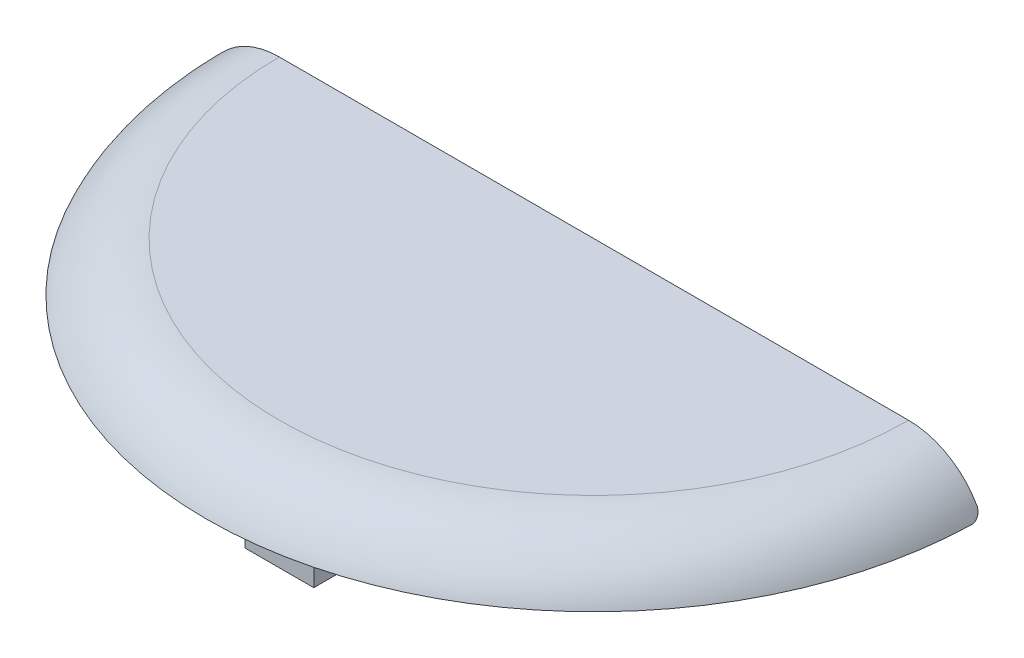
ISO-10303-21;
HEADER;
FILE_DESCRIPTION(('STEP AP214'),'2;1');
FILE_NAME('part.step','',(''),(''),'','','');
FILE_SCHEMA(('AUTOMOTIVE_DESIGN { 1 0 10303 214 1 1 1 1 }'));
ENDSEC;
DATA;
#1=APPLICATION_CONTEXT('core data for automotive mechanical design processes');
#2=APPLICATION_PROTOCOL_DEFINITION('international standard','automotive_design',2000,#1);
#3=PRODUCT_CONTEXT('',#1,'mechanical');
#4=PRODUCT('Part','Part','',(#3));
#5=PRODUCT_RELATED_PRODUCT_CATEGORY('part','',(#4));
#6=PRODUCT_DEFINITION_FORMATION('','',#4);
#7=PRODUCT_DEFINITION_CONTEXT('part definition',#1,'design');
#8=PRODUCT_DEFINITION('design','',#6,#7);
#9=PRODUCT_DEFINITION_SHAPE('','',#8);
#10=(LENGTH_UNIT() NAMED_UNIT(*) SI_UNIT(.MILLI.,.METRE.));
#11=(NAMED_UNIT(*) PLANE_ANGLE_UNIT() SI_UNIT($,.RADIAN.));
#12=(NAMED_UNIT(*) SI_UNIT($,.STERADIAN.) SOLID_ANGLE_UNIT());
#13=UNCERTAINTY_MEASURE_WITH_UNIT(LENGTH_MEASURE(1.E-05),#10,'distance_accuracy_value','');
#14=(GEOMETRIC_REPRESENTATION_CONTEXT(3) GLOBAL_UNCERTAINTY_ASSIGNED_CONTEXT((#13)) GLOBAL_UNIT_ASSIGNED_CONTEXT((#10,
#11,#12)) REPRESENTATION_CONTEXT('',''));
#15=CARTESIAN_POINT('',(0.,0.,0.));
#16=DIRECTION('',(0.,0.,1.));
#17=DIRECTION('',(1.,0.,0.));
#18=AXIS2_PLACEMENT_3D('',#15,#16,#17);
#19=CARTESIAN_POINT('',(0.,58.4278760968653,0.));
#20=DIRECTION('',(0.,1.,0.));
#21=DIRECTION('',(0.,0.,1.));
#22=AXIS2_PLACEMENT_3D('',#19,#20,#21);
#23=PLANE('',#22);
#24=DIRECTION('',(1.,0.,0.));
#25=VECTOR('',#24,1.);
#26=CARTESIAN_POINT('',(-3.5,58.4278760968653,32.));
#27=LINE('',#26,#25);
#28=CARTESIAN_POINT('',(-3.5,58.4278760968653,32.));
#29=VERTEX_POINT('',#28);
#30=CARTESIAN_POINT('',(3.5,58.4278760968653,32.));
#31=VERTEX_POINT('',#30);
#32=EDGE_CURVE('E129',#29,#31,#27,.T.);
#33=ORIENTED_EDGE('',*,*,#32,.T.);
#34=DIRECTION('',(0.,0.,-1.));
#35=VECTOR('',#34,1.);
#36=CARTESIAN_POINT('',(3.5,58.4278760968653,27.));
#37=LINE('',#36,#35);
#38=CARTESIAN_POINT('',(3.5,58.4278760968653,27.));
#39=VERTEX_POINT('',#38);
#40=EDGE_CURVE('E142',#31,#39,#37,.T.);
#41=ORIENTED_EDGE('',*,*,#40,.T.);
#42=DIRECTION('',(-1.,0.,0.));
#43=VECTOR('',#42,1.);
#44=CARTESIAN_POINT('',(-3.5,58.4278760968653,27.));
#45=LINE('',#44,#43);
#46=CARTESIAN_POINT('',(-3.5,58.4278760968653,27.));
#47=VERTEX_POINT('',#46);
#48=EDGE_CURVE('E106',#39,#47,#45,.T.);
#49=ORIENTED_EDGE('',*,*,#48,.T.);
#50=DIRECTION('',(0.,0.,1.));
#51=VECTOR('',#50,1.);
#52=CARTESIAN_POINT('',(-3.5,58.4278760968653,27.));
#53=LINE('',#52,#51);
#54=EDGE_CURVE('E133',#47,#29,#53,.T.);
#55=ORIENTED_EDGE('',*,*,#54,.T.);
#56=EDGE_LOOP('',(#33,#41,#49,#55));
#57=FACE_BOUND('',#56,.T.);
#58=CARTESIAN_POINT('',(0.,58.4278760968653,0.));
#59=DIRECTION('',(0.,1.,0.));
#60=DIRECTION('',(0.,0.,1.));
#61=AXIS2_PLACEMENT_3D('',#58,#59,#60);
#62=CIRCLE('',#61,39.4161984870957);
#63=CARTESIAN_POINT('',(39.4035113051378,58.4278760968653,0.999999999999999));
#64=VERTEX_POINT('',#63);
#65=CARTESIAN_POINT('',(-39.4035113051378,58.4278760968653,1.));
#66=VERTEX_POINT('',#65);
#67=EDGE_CURVE('E196',#64,#66,#62,.F.);
#68=ORIENTED_EDGE('',*,*,#67,.T.);
#69=DIRECTION('',(-1.,0.,0.));
#70=VECTOR('',#69,1.);
#71=CARTESIAN_POINT('',(0.,58.4278760968653,1.));
#72=LINE('',#71,#70);
#73=EDGE_CURVE('E12',#66,#64,#72,.F.);
#74=ORIENTED_EDGE('',*,*,#73,.T.);
#75=EDGE_LOOP('',(#68,#74));
#76=FACE_BOUND('',#75,.T.);
#77=ADVANCED_FACE('F42',(#57,#76),#23,.F.);
#78=CARTESIAN_POINT('',(0.,60.9278760968653,15.));
#79=DIRECTION('',(0.,0.,-1.));
#80=DIRECTION('',(-1.,0.,0.));
#81=AXIS2_PLACEMENT_3D('',#78,#79,#80);
#82=PLANE('',#81);
#83=CARTESIAN_POINT('',(0.,60.9278760968653,15.));
#84=DIRECTION('',(0.,0.,-1.));
#85=DIRECTION('',(-1.,0.,0.));
#86=AXIS2_PLACEMENT_3D('',#83,#84,#85);
#87=CIRCLE('',#86,1.);
#88=CARTESIAN_POINT('',(-1.,60.9278760968653,15.));
#89=VERTEX_POINT('',#88);
#90=EDGE_CURVE('E176',#89,#89,#87,.T.);
#91=ORIENTED_EDGE('',*,*,#90,.T.);
#92=EDGE_LOOP('',(#91));
#93=FACE_BOUND('',#92,.T.);
#94=ADVANCED_FACE('F231',(#93),#82,.T.);
#95=CARTESIAN_POINT('',(-30.4161984870957,60.9278760968653,15.));
#96=DIRECTION('',(0.,0.,-1.));
#97=DIRECTION('',(-1.,0.,0.));
#98=AXIS2_PLACEMENT_3D('',#95,#96,#97);
#99=PLANE('',#98);
#100=CARTESIAN_POINT('',(-30.4161984870957,60.9278760968653,15.));
#101=DIRECTION('',(0.,0.,-1.));
#102=DIRECTION('',(-1.,0.,0.));
#103=AXIS2_PLACEMENT_3D('',#100,#101,#102);
#104=CIRCLE('',#103,0.999999999999998);
#105=CARTESIAN_POINT('',(-31.4161984870957,60.9278760968653,15.));
#106=VERTEX_POINT('',#105);
#107=EDGE_CURVE('E168',#106,#106,#104,.T.);
#108=ORIENTED_EDGE('',*,*,#107,.T.);
#109=EDGE_LOOP('',(#108));
#110=FACE_BOUND('',#109,.T.);
#111=ADVANCED_FACE('F238',(#110),#99,.T.);
#112=CARTESIAN_POINT('',(30.4161984870957,60.9278760968653,15.));
#113=DIRECTION('',(0.,0.,-1.));
#114=DIRECTION('',(-1.,0.,0.));
#115=AXIS2_PLACEMENT_3D('',#112,#113,#114);
#116=PLANE('',#115);
#117=CARTESIAN_POINT('',(30.4161984870957,60.9278760968653,15.));
#118=DIRECTION('',(0.,0.,-1.));
#119=DIRECTION('',(-1.,0.,0.));
#120=AXIS2_PLACEMENT_3D('',#117,#118,#119);
#121=CIRCLE('',#120,1.);
#122=CARTESIAN_POINT('',(29.4161984870957,60.9278760968653,15.));
#123=VERTEX_POINT('',#122);
#124=EDGE_CURVE('E159',#123,#123,#121,.T.);
#125=ORIENTED_EDGE('',*,*,#124,.T.);
#126=EDGE_LOOP('',(#125));
#127=FACE_BOUND('',#126,.T.);
#128=ADVANCED_FACE('F228',(#127),#116,.T.);
#129=CARTESIAN_POINT('',(0.,63.4278760968653,0.));
#130=DIRECTION('',(0.,1.,0.));
#131=DIRECTION('',(0.,0.,1.));
#132=AXIS2_PLACEMENT_3D('',#129,#130,#131);
#133=PLANE('',#132);
#134=DIRECTION('',(1.,0.,0.));
#135=VECTOR('',#134,1.);
#136=CARTESIAN_POINT('',(0.,63.4278760968653,0.));
#137=LINE('',#136,#135);
#138=CARTESIAN_POINT('',(-32.,63.4278760968653,2.51386656396706E-13));
#139=VERTEX_POINT('',#138);
#140=CARTESIAN_POINT('',(32.,63.4278760968653,0.));
#141=VERTEX_POINT('',#140);
#142=EDGE_CURVE('E193',#139,#141,#137,.T.);
#143=ORIENTED_EDGE('',*,*,#142,.F.);
#144=CARTESIAN_POINT('',(0.,63.4278760968653,0.));
#145=DIRECTION('',(0.,-1.,0.));
#146=DIRECTION('',(0.,0.,-1.));
#147=AXIS2_PLACEMENT_3D('',#144,#145,#146);
#148=CIRCLE('',#147,32.);
#149=EDGE_CURVE('E189',#141,#139,#148,.T.);
#150=ORIENTED_EDGE('',*,*,#149,.F.);
#151=EDGE_LOOP('',(#143,#150));
#152=FACE_BOUND('',#151,.T.);
#153=ADVANCED_FACE('F223',(#152),#133,.T.);
#154=CARTESIAN_POINT('',(0.,55.4278760968653,0.));
#155=DIRECTION('',(0.,-1.,0.));
#156=DIRECTION('',(0.,0.,-1.));
#157=AXIS2_PLACEMENT_3D('',#154,#155,#156);
#158=TOROIDAL_SURFACE('',#157,32.,8.);
#159=CARTESIAN_POINT('',(-32.,55.4278760968653,1.1172740284298E-13));
#160=DIRECTION('',(0.,0.,1.));
#161=DIRECTION('',(1.,0.,0.));
#162=AXIS2_PLACEMENT_3D('',#159,#160,#161);
#163=CIRCLE('',#162,8.);
#164=CARTESIAN_POINT('',(-38.9282032302755,59.4278760968653,1.359170951332E-13));
#165=VERTEX_POINT('',#164);
#166=EDGE_CURVE('E186',#165,#139,#163,.F.);
#167=ORIENTED_EDGE('',*,*,#166,.F.);
#168=CARTESIAN_POINT('',(-38.9282032302755,59.4278760968653,0.));
#169=CARTESIAN_POINT('',(-38.9626021035287,59.3683581151527,-3.17048236836627E-05));
#170=CARTESIAN_POINT('',(-38.9962340636678,59.3082723680266,0.00531798358085913));
#171=CARTESIAN_POINT('',(-39.0612968632768,59.1885290354893,0.0271571008464615));
#172=CARTESIAN_POINT('',(-39.0927149168853,59.1288754803184,0.0437061785528483));
#173=CARTESIAN_POINT('',(-39.1524021685013,59.0120302331548,0.0884087723741813));
#174=CARTESIAN_POINT('',(-39.1806596390103,58.9548481636507,0.11660379703976));
#175=CARTESIAN_POINT('',(-39.2329834934601,58.8457032320536,0.18441081962347));
#176=CARTESIAN_POINT('',(-39.2570599904612,58.7937279084501,0.223994635332839));
#177=CARTESIAN_POINT('',(-39.2980442983298,58.7025297589063,0.309096562116425));
#178=CARTESIAN_POINT('',(-39.3154388107709,58.6625414441648,0.353558970440633));
#179=CARTESIAN_POINT('',(-39.3458391127704,58.5905998103798,0.449930194592522));
#180=CARTESIAN_POINT('',(-39.3588450774923,58.5586461706549,0.501838713099972));
#181=CARTESIAN_POINT('',(-39.3789942526035,58.5072986179241,0.605620590746932));
#182=CARTESIAN_POINT('',(-39.3866088664041,58.4869397080578,0.656928102552375));
#183=CARTESIAN_POINT('',(-39.3978795247534,58.4549157635044,0.762555422951551));
#184=CARTESIAN_POINT('',(-39.4015426585514,58.4432351710317,0.816869652529791));
#185=CARTESIAN_POINT('',(-39.4038573239905,58.4333803962425,0.893033255161506));
#186=CARTESIAN_POINT('',(-39.4042041769059,58.4313155276626,0.914393466162653));
#187=CARTESIAN_POINT('',(-39.4043021289989,58.4285650375151,0.957168034118493));
#188=CARTESIAN_POINT('',(-39.4040542240267,58.4278771139582,0.978582240674898));
#189=CARTESIAN_POINT('',(-39.4035113051378,58.4278760968653,1.));
#190=B_SPLINE_CURVE_WITH_KNOTS('',3,(#168,#169,#170,#171,#172,#173,#174,#175,#176,#177,#178,
#179,#180,#181,#182,#183,#184,#185,#186,#187,#188,#189),.UNSPECIFIED.,.F.,.F.,(4,2,2,2,2,2,2,2,
2,2,4),(0.,0.206184080947,0.413475048684915,0.62151130822178,0.829037133866088,1.01482828459576,
1.20061201882235,1.36693557851403,1.5329602425167,1.59730667196446,1.66154543631578),.UNSPECIFIED.);
#191=EDGE_CURVE('E52',#165,#66,#190,.T.);
#192=ORIENTED_EDGE('',*,*,#191,.T.);
#193=ORIENTED_EDGE('',*,*,#67,.F.);
#194=CARTESIAN_POINT('',(39.4035113051378,58.4278760968653,0.999999999999999));
#195=CARTESIAN_POINT('',(39.4041747014941,58.4278752737774,0.973846955871196));
#196=CARTESIAN_POINT('',(39.4043972477275,58.4289028365978,0.94769526000513));
#197=CARTESIAN_POINT('',(39.4039567084396,58.4330007972683,0.89556316845701));
#198=CARTESIAN_POINT('',(39.4032937313692,58.4360709449379,0.869582752189755));
#199=CARTESIAN_POINT('',(39.3999777610984,58.4482987139296,0.792306140445358));
#200=CARTESIAN_POINT('',(39.3960019878358,58.4604738731731,0.741505828150369));
#201=CARTESIAN_POINT('',(39.3845713611611,58.4924091608321,0.64279216435783));
#202=CARTESIAN_POINT('',(39.3771161063022,58.5121701644212,0.59487914670365));
#203=CARTESIAN_POINT('',(39.3588575144164,58.5585140885994,0.503160517804205));
#204=CARTESIAN_POINT('',(39.3480534154894,58.5850985613684,0.45935584421102));
#205=CARTESIAN_POINT('',(39.3230468158782,58.6447150552454,0.376030539357891));
#206=CARTESIAN_POINT('',(39.3087786843171,58.6778689925276,0.336617178781899));
#207=CARTESIAN_POINT('',(39.2772579152899,58.749077586112,0.263913452326962));
#208=CARTESIAN_POINT('',(39.2600051131391,58.7871325128059,0.230623424523458));
#209=CARTESIAN_POINT('',(39.2215485115199,58.8697382731035,0.168534448494099));
#210=CARTESIAN_POINT('',(39.2001528058787,58.9145572558606,0.140212253459962));
#211=CARTESIAN_POINT('',(39.1547586988788,59.0070772815275,0.0913352543510302));
#212=CARTESIAN_POINT('',(39.1307569342041,59.0547820127106,0.0707906449166165));
#213=CARTESIAN_POINT('',(39.0781926795937,59.1564924347534,0.0358860214786665));
#214=CARTESIAN_POINT('',(39.0494136995414,59.2106586363693,0.0223254593323006));
#215=CARTESIAN_POINT('',(38.9900303670043,59.3193284704951,0.00438361517163116));
#216=CARTESIAN_POINT('',(38.9594311056585,59.3738308120439,-2.21351311083883E-05));
#217=CARTESIAN_POINT('',(38.9282032302755,59.4278760968653,0.));
#218=B_SPLINE_CURVE_WITH_KNOTS('',3,(#194,#195,#196,#197,#198,#199,#200,#201,#202,#203,#204,
#205,#206,#207,#208,#209,#210,#211,#212,#213,#214,#215,#216,#217),.UNSPECIFIED.,.F.,.F.,(4,2,2,
2,2,2,2,2,2,2,2,4),(0.,0.0784355415039385,0.156861477809159,0.313213541485424,0.469583648814327,
0.625989358264571,0.785628077153142,0.945275607214232,1.11608549021736,1.28711849711743,
1.47484654534916,1.66207219948215),.UNSPECIFIED.);
#219=CARTESIAN_POINT('',(38.9282032302755,59.4278760968653,-1.359170951332E-13));
#220=VERTEX_POINT('',#219);
#221=EDGE_CURVE('E206',#64,#220,#218,.T.);
#222=ORIENTED_EDGE('',*,*,#221,.T.);
#223=CARTESIAN_POINT('',(32.,55.4278760968653,-1.1172740284298E-13));
#224=DIRECTION('',(0.,0.,1.));
#225=DIRECTION('',(1.,0.,0.));
#226=AXIS2_PLACEMENT_3D('',#223,#224,#225);
#227=CIRCLE('',#226,8.);
#228=EDGE_CURVE('E163',#141,#220,#227,.F.);
#229=ORIENTED_EDGE('',*,*,#228,.F.);
#230=ORIENTED_EDGE('',*,*,#149,.T.);
#231=EDGE_LOOP('',(#167,#192,#193,#222,#229,#230));
#232=FACE_BOUND('',#231,.T.);
#233=ADVANCED_FACE('F217',(#232),#158,.T.);
#234=CARTESIAN_POINT('',(0.,60.9278760968653,15.));
#235=DIRECTION('',(0.,0.,-1.));
#236=DIRECTION('',(-1.,0.,0.));
#237=AXIS2_PLACEMENT_3D('',#234,#235,#236);
#238=CYLINDRICAL_SURFACE('',#237,1.);
#239=ORIENTED_EDGE('',*,*,#90,.F.);
#240=EDGE_LOOP('',(#239));
#241=FACE_BOUND('',#240,.T.);
#242=CARTESIAN_POINT('',(0.,60.9278760968653,0.));
#243=DIRECTION('',(0.,0.,-1.));
#244=DIRECTION('',(-1.,0.,0.));
#245=AXIS2_PLACEMENT_3D('',#242,#243,#244);
#246=CIRCLE('',#245,1.);
#247=CARTESIAN_POINT('',(-1.,60.9278760968653,0.));
#248=VERTEX_POINT('',#247);
#249=EDGE_CURVE('E153',#248,#248,#246,.T.);
#250=ORIENTED_EDGE('',*,*,#249,.T.);
#251=EDGE_LOOP('',(#250));
#252=FACE_BOUND('',#251,.T.);
#253=ADVANCED_FACE('F222',(#241,#252),#238,.F.);
#254=CARTESIAN_POINT('',(-30.4161984870957,60.9278760968653,15.));
#255=DIRECTION('',(0.,0.,-1.));
#256=DIRECTION('',(-1.,0.,0.));
#257=AXIS2_PLACEMENT_3D('',#254,#255,#256);
#258=CYLINDRICAL_SURFACE('',#257,0.999999999999998);
#259=ORIENTED_EDGE('',*,*,#107,.F.);
#260=EDGE_LOOP('',(#259));
#261=FACE_BOUND('',#260,.T.);
#262=CARTESIAN_POINT('',(-30.4161984870957,60.9278760968653,0.));
#263=DIRECTION('',(0.,0.,-1.));
#264=DIRECTION('',(-1.,0.,0.));
#265=AXIS2_PLACEMENT_3D('',#262,#263,#264);
#266=CIRCLE('',#265,0.999999999999998);
#267=CARTESIAN_POINT('',(-31.4161984870957,60.9278760968653,0.));
#268=VERTEX_POINT('',#267);
#269=EDGE_CURVE('E172',#268,#268,#266,.T.);
#270=ORIENTED_EDGE('',*,*,#269,.T.);
#271=EDGE_LOOP('',(#270));
#272=FACE_BOUND('',#271,.T.);
#273=ADVANCED_FACE('F251',(#261,#272),#258,.F.);
#274=CARTESIAN_POINT('',(30.4161984870957,60.9278760968653,15.));
#275=DIRECTION('',(0.,0.,-1.));
#276=DIRECTION('',(-1.,0.,0.));
#277=AXIS2_PLACEMENT_3D('',#274,#275,#276);
#278=CYLINDRICAL_SURFACE('',#277,1.);
#279=ORIENTED_EDGE('',*,*,#124,.F.);
#280=EDGE_LOOP('',(#279));
#281=FACE_BOUND('',#280,.T.);
#282=CARTESIAN_POINT('',(30.4161984870957,60.9278760968653,0.));
#283=DIRECTION('',(0.,0.,-1.));
#284=DIRECTION('',(-1.,0.,0.));
#285=AXIS2_PLACEMENT_3D('',#282,#283,#284);
#286=CIRCLE('',#285,1.);
#287=CARTESIAN_POINT('',(29.4161984870957,60.9278760968653,0.));
#288=VERTEX_POINT('',#287);
#289=EDGE_CURVE('E164',#288,#288,#286,.T.);
#290=ORIENTED_EDGE('',*,*,#289,.T.);
#291=EDGE_LOOP('',(#290));
#292=FACE_BOUND('',#291,.T.);
#293=ADVANCED_FACE('F242',(#281,#292),#278,.F.);
#294=CARTESIAN_POINT('',(21.,73.,0.));
#295=DIRECTION('',(0.,0.,1.));
#296=DIRECTION('',(1.,0.,0.));
#297=AXIS2_PLACEMENT_3D('',#294,#295,#296);
#298=PLANE('',#297);
#299=ORIENTED_EDGE('',*,*,#289,.F.);
#300=EDGE_LOOP('',(#299));
#301=FACE_BOUND('',#300,.T.);
#302=ORIENTED_EDGE('',*,*,#269,.F.);
#303=EDGE_LOOP('',(#302));
#304=FACE_BOUND('',#303,.T.);
#305=ORIENTED_EDGE('',*,*,#249,.F.);
#306=EDGE_LOOP('',(#305));
#307=FACE_BOUND('',#306,.T.);
#308=ORIENTED_EDGE('',*,*,#228,.T.);
#309=DIRECTION('',(-1.,0.,0.));
#310=VECTOR('',#309,1.);
#311=CARTESIAN_POINT('',(21.,59.4278760968653,0.));
#312=LINE('',#311,#310);
#313=EDGE_CURVE('E199',#220,#165,#312,.T.);
#314=ORIENTED_EDGE('',*,*,#313,.T.);
#315=ORIENTED_EDGE('',*,*,#166,.T.);
#316=ORIENTED_EDGE('',*,*,#142,.T.);
#317=EDGE_LOOP('',(#308,#314,#315,#316));
#318=FACE_BOUND('',#317,.T.);
#319=ADVANCED_FACE('F224',(#301,#304,#307,#318),#298,.F.);
#320=CARTESIAN_POINT('',(3.5,50.4278760968653,27.));
#321=DIRECTION('',(1.,0.,0.));
#322=DIRECTION('',(0.,0.,-1.));
#323=AXIS2_PLACEMENT_3D('',#320,#321,#322);
#324=PLANE('',#323);
#325=CARTESIAN_POINT('',(3.49999999999999,54.4278760968653,29.5));
#326=DIRECTION('',(1.,0.,0.));
#327=DIRECTION('',(0.,0.,-1.));
#328=AXIS2_PLACEMENT_3D('',#325,#326,#327);
#329=CIRCLE('',#328,1.);
#330=CARTESIAN_POINT('',(3.49999999999999,54.4278760968653,28.5));
#331=VERTEX_POINT('',#330);
#332=EDGE_CURVE('E136',#331,#331,#329,.T.);
#333=ORIENTED_EDGE('',*,*,#332,.F.);
#334=EDGE_LOOP('',(#333));
#335=FACE_BOUND('',#334,.T.);
#336=ORIENTED_EDGE('',*,*,#40,.F.);
#337=DIRECTION('',(0.,1.,0.));
#338=VECTOR('',#337,1.);
#339=CARTESIAN_POINT('',(3.5,50.4278760968653,32.));
#340=LINE('',#339,#338);
#341=CARTESIAN_POINT('',(3.5,50.4278760968653,32.));
#342=VERTEX_POINT('',#341);
#343=EDGE_CURVE('E127',#342,#31,#340,.T.);
#344=ORIENTED_EDGE('',*,*,#343,.F.);
#345=DIRECTION('',(0.,0.,-1.));
#346=VECTOR('',#345,1.);
#347=CARTESIAN_POINT('',(3.5,50.4278760968653,27.));
#348=LINE('',#347,#346);
#349=CARTESIAN_POINT('',(3.5,50.4278760968653,27.));
#350=VERTEX_POINT('',#349);
#351=EDGE_CURVE('E120',#342,#350,#348,.T.);
#352=ORIENTED_EDGE('',*,*,#351,.T.);
#353=DIRECTION('',(0.,1.,0.));
#354=VECTOR('',#353,1.);
#355=CARTESIAN_POINT('',(3.5,50.4278760968653,27.));
#356=LINE('',#355,#354);
#357=EDGE_CURVE('E100',#350,#39,#356,.T.);
#358=ORIENTED_EDGE('',*,*,#357,.T.);
#359=EDGE_LOOP('',(#336,#344,#352,#358));
#360=FACE_BOUND('',#359,.T.);
#361=ADVANCED_FACE('F126',(#335,#360),#324,.T.);
#362=CARTESIAN_POINT('',(-3.5,50.4278760968653,32.));
#363=DIRECTION('',(0.,0.,1.));
#364=DIRECTION('',(1.,0.,0.));
#365=AXIS2_PLACEMENT_3D('',#362,#363,#364);
#366=PLANE('',#365);
#367=ORIENTED_EDGE('',*,*,#32,.F.);
#368=DIRECTION('',(0.,1.,0.));
#369=VECTOR('',#368,1.);
#370=CARTESIAN_POINT('',(-3.5,50.4278760968653,32.));
#371=LINE('',#370,#369);
#372=CARTESIAN_POINT('',(-3.5,50.4278760968653,32.));
#373=VERTEX_POINT('',#372);
#374=EDGE_CURVE('E154',#373,#29,#371,.T.);
#375=ORIENTED_EDGE('',*,*,#374,.F.);
#376=DIRECTION('',(1.,0.,0.));
#377=VECTOR('',#376,1.);
#378=CARTESIAN_POINT('',(-3.5,50.4278760968653,32.));
#379=LINE('',#378,#377);
#380=EDGE_CURVE('E113',#373,#342,#379,.T.);
#381=ORIENTED_EDGE('',*,*,#380,.T.);
#382=ORIENTED_EDGE('',*,*,#343,.T.);
#383=EDGE_LOOP('',(#367,#375,#381,#382));
#384=FACE_BOUND('',#383,.T.);
#385=ADVANCED_FACE('F247',(#384),#366,.T.);
#386=CARTESIAN_POINT('',(-3.5,50.4278760968653,27.));
#387=DIRECTION('',(-1.,0.,0.));
#388=DIRECTION('',(0.,0.,1.));
#389=AXIS2_PLACEMENT_3D('',#386,#387,#388);
#390=PLANE('',#389);
#391=CARTESIAN_POINT('',(-3.5,54.4278760968653,29.5));
#392=DIRECTION('',(-1.,0.,0.));
#393=DIRECTION('',(0.,0.,1.));
#394=AXIS2_PLACEMENT_3D('',#391,#392,#393);
#395=CIRCLE('',#394,1.);
#396=CARTESIAN_POINT('',(-3.5,54.4278760968653,30.5));
#397=VERTEX_POINT('',#396);
#398=EDGE_CURVE('E145',#397,#397,#395,.T.);
#399=ORIENTED_EDGE('',*,*,#398,.F.);
#400=EDGE_LOOP('',(#399));
#401=FACE_BOUND('',#400,.T.);
#402=ORIENTED_EDGE('',*,*,#54,.F.);
#403=DIRECTION('',(0.,1.,0.));
#404=VECTOR('',#403,1.);
#405=CARTESIAN_POINT('',(-3.5,50.4278760968653,27.));
#406=LINE('',#405,#404);
#407=CARTESIAN_POINT('',(-3.5,50.4278760968653,27.));
#408=VERTEX_POINT('',#407);
#409=EDGE_CURVE('E112',#408,#47,#406,.T.);
#410=ORIENTED_EDGE('',*,*,#409,.F.);
#411=DIRECTION('',(0.,0.,1.));
#412=VECTOR('',#411,1.);
#413=CARTESIAN_POINT('',(-3.5,50.4278760968653,27.));
#414=LINE('',#413,#412);
#415=EDGE_CURVE('E123',#408,#373,#414,.T.);
#416=ORIENTED_EDGE('',*,*,#415,.T.);
#417=ORIENTED_EDGE('',*,*,#374,.T.);
#418=EDGE_LOOP('',(#402,#410,#416,#417));
#419=FACE_BOUND('',#418,.T.);
#420=ADVANCED_FACE('F281',(#401,#419),#390,.T.);
#421=CARTESIAN_POINT('',(-3.5,50.4278760968653,27.));
#422=DIRECTION('',(0.,0.,-1.));
#423=DIRECTION('',(-1.,0.,0.));
#424=AXIS2_PLACEMENT_3D('',#421,#422,#423);
#425=PLANE('',#424);
#426=ORIENTED_EDGE('',*,*,#48,.F.);
#427=ORIENTED_EDGE('',*,*,#357,.F.);
#428=DIRECTION('',(-1.,0.,0.));
#429=VECTOR('',#428,1.);
#430=CARTESIAN_POINT('',(-3.5,50.4278760968653,27.));
#431=LINE('',#430,#429);
#432=EDGE_CURVE('E104',#350,#408,#431,.T.);
#433=ORIENTED_EDGE('',*,*,#432,.T.);
#434=ORIENTED_EDGE('',*,*,#409,.T.);
#435=EDGE_LOOP('',(#426,#427,#433,#434));
#436=FACE_BOUND('',#435,.T.);
#437=ADVANCED_FACE('F102',(#436),#425,.T.);
#438=CARTESIAN_POINT('',(0.,50.4278760968653,0.));
#439=DIRECTION('',(0.,1.,0.));
#440=DIRECTION('',(0.,0.,1.));
#441=AXIS2_PLACEMENT_3D('',#438,#439,#440);
#442=PLANE('',#441);
#443=ORIENTED_EDGE('',*,*,#351,.F.);
#444=ORIENTED_EDGE('',*,*,#380,.F.);
#445=ORIENTED_EDGE('',*,*,#415,.F.);
#446=ORIENTED_EDGE('',*,*,#432,.F.);
#447=EDGE_LOOP('',(#443,#444,#445,#446));
#448=FACE_BOUND('',#447,.T.);
#449=ADVANCED_FACE('F118',(#448),#442,.F.);
#450=CARTESIAN_POINT('',(-4.00000000000001,54.4278760968653,29.5));
#451=DIRECTION('',(1.,0.,0.));
#452=DIRECTION('',(0.,0.,-1.));
#453=AXIS2_PLACEMENT_3D('',#450,#451,#452);
#454=CYLINDRICAL_SURFACE('',#453,1.);
#455=ORIENTED_EDGE('',*,*,#398,.T.);
#456=EDGE_LOOP('',(#455));
#457=FACE_BOUND('',#456,.T.);
#458=ORIENTED_EDGE('',*,*,#332,.T.);
#459=EDGE_LOOP('',(#458));
#460=FACE_BOUND('',#459,.T.);
#461=ADVANCED_FACE('F268',(#457,#460),#454,.F.);
#462=CARTESIAN_POINT('',(21.,59.4278760968653,1.));
#463=DIRECTION('',(-1.,0.,0.));
#464=DIRECTION('',(0.,0.,1.));
#465=AXIS2_PLACEMENT_3D('',#462,#463,#464);
#466=CYLINDRICAL_SURFACE('',#465,1.);
#467=ORIENTED_EDGE('',*,*,#221,.F.);
#468=ORIENTED_EDGE('',*,*,#73,.F.);
#469=ORIENTED_EDGE('',*,*,#191,.F.);
#470=ORIENTED_EDGE('',*,*,#313,.F.);
#471=EDGE_LOOP('',(#467,#468,#469,#470));
#472=FACE_BOUND('',#471,.T.);
#473=ADVANCED_FACE('F44',(#472),#466,.T.);
#474=CLOSED_SHELL('',(#77,#94,#111,#128,#153,#233,#253,#273,#293,#319,#361,#385,#420,#437,#449,
#461,#473));
#475=MANIFOLD_SOLID_BREP('B2',#474);
#476=ADVANCED_BREP_SHAPE_REPRESENTATION('',(#18,#475),#14);
#477=SHAPE_DEFINITION_REPRESENTATION(#9,#476);
ENDSEC;
END-ISO-10303-21;
